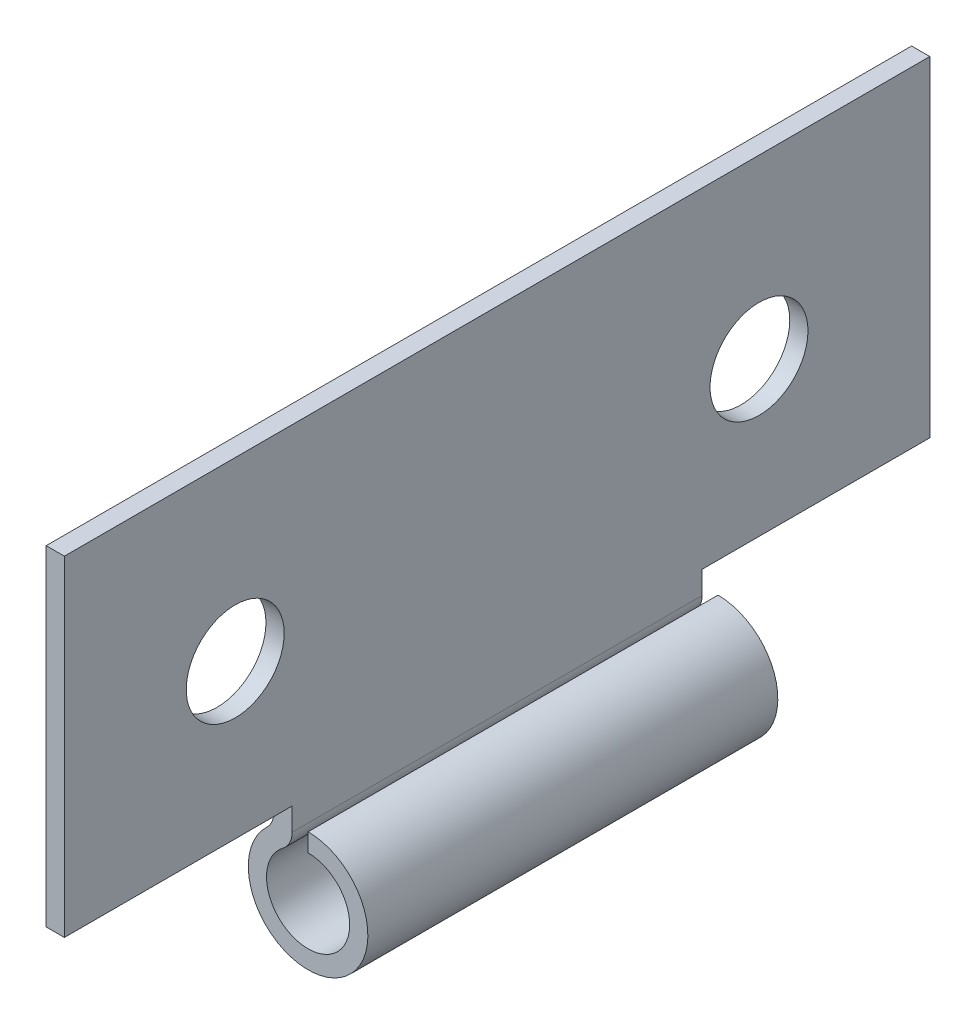
ISO-10303-21;
HEADER;
FILE_DESCRIPTION(('STEP AP214'),'2;1');
FILE_NAME('part.step','',(''),(''),'','','');
FILE_SCHEMA(('AUTOMOTIVE_DESIGN { 1 0 10303 214 1 1 1 1 }'));
ENDSEC;
DATA;
#1=APPLICATION_CONTEXT('core data for automotive mechanical design processes');
#2=APPLICATION_PROTOCOL_DEFINITION('international standard','automotive_design',2000,#1);
#3=PRODUCT_CONTEXT('',#1,'mechanical');
#4=PRODUCT('Part','Part','',(#3));
#5=PRODUCT_RELATED_PRODUCT_CATEGORY('part','',(#4));
#6=PRODUCT_DEFINITION_FORMATION('','',#4);
#7=PRODUCT_DEFINITION_CONTEXT('part definition',#1,'design');
#8=PRODUCT_DEFINITION('design','',#6,#7);
#9=PRODUCT_DEFINITION_SHAPE('','',#8);
#10=(LENGTH_UNIT() NAMED_UNIT(*) SI_UNIT(.MILLI.,.METRE.));
#11=(NAMED_UNIT(*) PLANE_ANGLE_UNIT() SI_UNIT($,.RADIAN.));
#12=(NAMED_UNIT(*) SI_UNIT($,.STERADIAN.) SOLID_ANGLE_UNIT());
#13=UNCERTAINTY_MEASURE_WITH_UNIT(LENGTH_MEASURE(1.E-05),#10,'distance_accuracy_value','');
#14=(GEOMETRIC_REPRESENTATION_CONTEXT(3) GLOBAL_UNCERTAINTY_ASSIGNED_CONTEXT((#13)) GLOBAL_UNIT_ASSIGNED_CONTEXT((#10,
#11,#12)) REPRESENTATION_CONTEXT('',''));
#15=CARTESIAN_POINT('',(0.,0.,0.));
#16=DIRECTION('',(0.,0.,1.));
#17=DIRECTION('',(1.,0.,0.));
#18=AXIS2_PLACEMENT_3D('',#15,#16,#17);
#19=CARTESIAN_POINT('',(0.,0.,38.));
#20=DIRECTION('',(1.,0.,0.));
#21=DIRECTION('',(0.,0.,-1.));
#22=AXIS2_PLACEMENT_3D('',#19,#20,#21);
#23=PLANE('',#22);
#24=CARTESIAN_POINT('',(0.,7.38124134347369,30.5));
#25=DIRECTION('',(1.,0.,0.));
#26=DIRECTION('',(0.,0.,-1.));
#27=AXIS2_PLACEMENT_3D('',#24,#25,#26);
#28=CIRCLE('',#27,2.15);
#29=CARTESIAN_POINT('',(0.,7.38124134347369,28.35));
#30=VERTEX_POINT('',#29);
#31=EDGE_CURVE('E177',#30,#30,#28,.F.);
#32=ORIENTED_EDGE('',*,*,#31,.F.);
#33=EDGE_LOOP('',(#32));
#34=FACE_BOUND('',#33,.T.);
#35=CARTESIAN_POINT('',(0.,7.38124134347369,7.5));
#36=DIRECTION('',(1.,0.,0.));
#37=DIRECTION('',(0.,0.,-1.));
#38=AXIS2_PLACEMENT_3D('',#35,#36,#37);
#39=CIRCLE('',#38,2.15);
#40=CARTESIAN_POINT('',(0.,7.38124134347369,5.35));
#41=VERTEX_POINT('',#40);
#42=EDGE_CURVE('E178',#41,#41,#39,.F.);
#43=ORIENTED_EDGE('',*,*,#42,.F.);
#44=EDGE_LOOP('',(#43));
#45=FACE_BOUND('',#44,.T.);
#46=DIRECTION('',(0.,0.,-1.));
#47=VECTOR('',#46,1.);
#48=CARTESIAN_POINT('',(0.,0.631241343473685,38.));
#49=LINE('',#48,#47);
#50=CARTESIAN_POINT('',(0.,0.631241343473685,38.));
#51=VERTEX_POINT('',#50);
#52=CARTESIAN_POINT('',(0.,0.631241343473685,28.));
#53=VERTEX_POINT('',#52);
#54=EDGE_CURVE('E145',#51,#53,#49,.T.);
#55=ORIENTED_EDGE('',*,*,#54,.F.);
#56=DIRECTION('',(0.,-1.,0.));
#57=VECTOR('',#56,1.);
#58=CARTESIAN_POINT('',(0.,0.,38.));
#59=LINE('',#58,#57);
#60=CARTESIAN_POINT('',(0.,15.1312413434737,38.));
#61=VERTEX_POINT('',#60);
#62=EDGE_CURVE('E189',#61,#51,#59,.T.);
#63=ORIENTED_EDGE('',*,*,#62,.F.);
#64=DIRECTION('',(0.,0.,-1.));
#65=VECTOR('',#64,1.);
#66=CARTESIAN_POINT('',(0.,15.1312413434737,38.));
#67=LINE('',#66,#65);
#68=CARTESIAN_POINT('',(0.,15.1312413434737,0.));
#69=VERTEX_POINT('',#68);
#70=EDGE_CURVE('E219',#61,#69,#67,.T.);
#71=ORIENTED_EDGE('',*,*,#70,.T.);
#72=DIRECTION('',(0.,-1.,0.));
#73=VECTOR('',#72,1.);
#74=CARTESIAN_POINT('',(0.,0.,0.));
#75=LINE('',#74,#73);
#76=CARTESIAN_POINT('',(0.,0.631241343473684,0.));
#77=VERTEX_POINT('',#76);
#78=EDGE_CURVE('E143',#69,#77,#75,.T.);
#79=ORIENTED_EDGE('',*,*,#78,.T.);
#80=DIRECTION('',(0.,0.,-1.));
#81=VECTOR('',#80,1.);
#82=CARTESIAN_POINT('',(0.,0.631241343473685,38.));
#83=LINE('',#82,#81);
#84=CARTESIAN_POINT('',(0.,0.631241343473685,10.));
#85=VERTEX_POINT('',#84);
#86=EDGE_CURVE('E57',#85,#77,#83,.T.);
#87=ORIENTED_EDGE('',*,*,#86,.F.);
#88=DIRECTION('',(0.,-1.,0.));
#89=VECTOR('',#88,1.);
#90=CARTESIAN_POINT('',(0.,0.,9.99999999999999));
#91=LINE('',#90,#89);
#92=CARTESIAN_POINT('',(0.,0.,9.99999999999999));
#93=VERTEX_POINT('',#92);
#94=EDGE_CURVE('E124',#85,#93,#91,.T.);
#95=ORIENTED_EDGE('',*,*,#94,.T.);
#96=DIRECTION('',(0.,0.,-1.));
#97=VECTOR('',#96,1.);
#98=CARTESIAN_POINT('',(0.,0.,38.));
#99=LINE('',#98,#97);
#100=CARTESIAN_POINT('',(0.,0.,28.));
#101=VERTEX_POINT('',#100);
#102=EDGE_CURVE('E217',#101,#93,#99,.T.);
#103=ORIENTED_EDGE('',*,*,#102,.F.);
#104=DIRECTION('',(0.,-1.,0.));
#105=VECTOR('',#104,1.);
#106=CARTESIAN_POINT('',(0.,0.,28.));
#107=LINE('',#106,#105);
#108=EDGE_CURVE('E171',#53,#101,#107,.T.);
#109=ORIENTED_EDGE('',*,*,#108,.F.);
#110=EDGE_LOOP('',(#55,#63,#71,#79,#87,#95,#103,#109));
#111=FACE_BOUND('',#110,.T.);
#112=ADVANCED_FACE('F34',(#34,#45,#111),#23,.F.);
#113=CARTESIAN_POINT('',(-1.,0.,38.));
#114=DIRECTION('',(0.,0.,-1.));
#115=DIRECTION('',(-1.,0.,0.));
#116=AXIS2_PLACEMENT_3D('',#113,#114,#115);
#117=CYLINDRICAL_SURFACE('',#116,1.);
#118=CARTESIAN_POINT('',(-1.,0.,28.));
#119=DIRECTION('',(0.,0.,1.));
#120=DIRECTION('',(1.,0.,0.));
#121=AXIS2_PLACEMENT_3D('',#118,#119,#120);
#122=CIRCLE('',#121,1.);
#123=CARTESIAN_POINT('',(-0.310344827586207,-0.724137931034484,28.));
#124=VERTEX_POINT('',#123);
#125=EDGE_CURVE('E169',#101,#124,#122,.F.);
#126=ORIENTED_EDGE('',*,*,#125,.F.);
#127=ORIENTED_EDGE('',*,*,#102,.T.);
#128=CARTESIAN_POINT('',(-1.,0.,9.99999999999999));
#129=DIRECTION('',(0.,0.,1.));
#130=DIRECTION('',(1.,0.,0.));
#131=AXIS2_PLACEMENT_3D('',#128,#129,#130);
#132=CIRCLE('',#131,1.);
#133=CARTESIAN_POINT('',(-0.310344827586207,-0.724137931034484,9.99999999999999));
#134=VERTEX_POINT('',#133);
#135=EDGE_CURVE('E129',#93,#134,#132,.F.);
#136=ORIENTED_EDGE('',*,*,#135,.T.);
#137=DIRECTION('',(0.,0.,-1.));
#138=VECTOR('',#137,1.);
#139=CARTESIAN_POINT('',(-0.310344827586207,-0.724137931034484,38.));
#140=LINE('',#139,#138);
#141=EDGE_CURVE('E214',#124,#134,#140,.T.);
#142=ORIENTED_EDGE('',*,*,#141,.F.);
#143=EDGE_LOOP('',(#126,#127,#136,#142));
#144=FACE_BOUND('',#143,.T.);
#145=ADVANCED_FACE('F248',(#144),#117,.F.);
#146=CARTESIAN_POINT('',(1.5,-2.625,38.));
#147=DIRECTION('',(0.,0.,-1.));
#148=DIRECTION('',(-1.,0.,0.));
#149=AXIS2_PLACEMENT_3D('',#146,#147,#148);
#150=CYLINDRICAL_SURFACE('',#149,2.625);
#151=DIRECTION('',(0.,0.,-1.));
#152=VECTOR('',#151,1.);
#153=CARTESIAN_POINT('',(1.5,0.,38.));
#154=LINE('',#153,#152);
#155=CARTESIAN_POINT('',(1.5,0.,28.));
#156=VERTEX_POINT('',#155);
#157=CARTESIAN_POINT('',(1.5,0.,9.99999999999999));
#158=VERTEX_POINT('',#157);
#159=EDGE_CURVE('E211',#156,#158,#154,.T.);
#160=ORIENTED_EDGE('',*,*,#159,.F.);
#161=CARTESIAN_POINT('',(1.5,-2.625,28.));
#162=DIRECTION('',(0.,0.,1.));
#163=DIRECTION('',(1.,0.,0.));
#164=AXIS2_PLACEMENT_3D('',#161,#162,#163);
#165=CIRCLE('',#164,2.625);
#166=EDGE_CURVE('E167',#124,#156,#165,.T.);
#167=ORIENTED_EDGE('',*,*,#166,.F.);
#168=ORIENTED_EDGE('',*,*,#141,.T.);
#169=CARTESIAN_POINT('',(1.5,-2.625,9.99999999999999));
#170=DIRECTION('',(0.,0.,1.));
#171=DIRECTION('',(1.,0.,0.));
#172=AXIS2_PLACEMENT_3D('',#169,#170,#171);
#173=CIRCLE('',#172,2.625);
#174=EDGE_CURVE('E159',#134,#158,#173,.T.);
#175=ORIENTED_EDGE('',*,*,#174,.T.);
#176=EDGE_LOOP('',(#160,#167,#168,#175));
#177=FACE_BOUND('',#176,.T.);
#178=ADVANCED_FACE('F244',(#177),#150,.T.);
#179=CARTESIAN_POINT('',(1.5,0.,38.));
#180=DIRECTION('',(1.,0.,0.));
#181=DIRECTION('',(0.,0.,-1.));
#182=AXIS2_PLACEMENT_3D('',#179,#180,#181);
#183=PLANE('',#182);
#184=DIRECTION('',(0.,-1.,0.));
#185=VECTOR('',#184,1.);
#186=CARTESIAN_POINT('',(1.5,0.,28.));
#187=LINE('',#186,#185);
#188=CARTESIAN_POINT('',(1.5,-0.8,28.));
#189=VERTEX_POINT('',#188);
#190=EDGE_CURVE('E165',#156,#189,#187,.T.);
#191=ORIENTED_EDGE('',*,*,#190,.F.);
#192=ORIENTED_EDGE('',*,*,#159,.T.);
#193=DIRECTION('',(0.,-1.,0.));
#194=VECTOR('',#193,1.);
#195=CARTESIAN_POINT('',(1.5,0.,9.99999999999999));
#196=LINE('',#195,#194);
#197=CARTESIAN_POINT('',(1.5,-0.8,9.99999999999999));
#198=VERTEX_POINT('',#197);
#199=EDGE_CURVE('E156',#158,#198,#196,.T.);
#200=ORIENTED_EDGE('',*,*,#199,.T.);
#201=DIRECTION('',(0.,0.,-1.));
#202=VECTOR('',#201,1.);
#203=CARTESIAN_POINT('',(1.5,-0.8,38.));
#204=LINE('',#203,#202);
#205=EDGE_CURVE('E208',#189,#198,#204,.T.);
#206=ORIENTED_EDGE('',*,*,#205,.F.);
#207=EDGE_LOOP('',(#191,#192,#200,#206));
#208=FACE_BOUND('',#207,.T.);
#209=ADVANCED_FACE('F240',(#208),#183,.F.);
#210=CARTESIAN_POINT('',(1.5,-2.625,38.));
#211=DIRECTION('',(0.,0.,-1.));
#212=DIRECTION('',(-1.,0.,0.));
#213=AXIS2_PLACEMENT_3D('',#210,#211,#212);
#214=CYLINDRICAL_SURFACE('',#213,1.825);
#215=CARTESIAN_POINT('',(1.5,-2.625,28.));
#216=DIRECTION('',(0.,0.,1.));
#217=DIRECTION('',(1.,0.,0.));
#218=AXIS2_PLACEMENT_3D('',#215,#216,#217);
#219=CIRCLE('',#218,1.825);
#220=CARTESIAN_POINT('',(0.401769911504423,-1.16742815864089,28.));
#221=VERTEX_POINT('',#220);
#222=EDGE_CURVE('E163',#189,#221,#219,.F.);
#223=ORIENTED_EDGE('',*,*,#222,.F.);
#224=ORIENTED_EDGE('',*,*,#205,.T.);
#225=CARTESIAN_POINT('',(1.5,-2.625,9.99999999999999));
#226=DIRECTION('',(0.,0.,1.));
#227=DIRECTION('',(1.,0.,0.));
#228=AXIS2_PLACEMENT_3D('',#225,#226,#227);
#229=CIRCLE('',#228,1.825);
#230=CARTESIAN_POINT('',(0.401769911504423,-1.16742815864089,9.99999999999999));
#231=VERTEX_POINT('',#230);
#232=EDGE_CURVE('E153',#198,#231,#229,.F.);
#233=ORIENTED_EDGE('',*,*,#232,.T.);
#234=DIRECTION('',(0.,0.,-1.));
#235=VECTOR('',#234,1.);
#236=CARTESIAN_POINT('',(0.401769911504423,-1.16742815864089,38.));
#237=LINE('',#236,#235);
#238=EDGE_CURVE('E205',#221,#231,#237,.T.);
#239=ORIENTED_EDGE('',*,*,#238,.F.);
#240=EDGE_LOOP('',(#223,#224,#233,#239));
#241=FACE_BOUND('',#240,.T.);
#242=ADVANCED_FACE('F235',(#241),#214,.F.);
#243=CARTESIAN_POINT('',(-0.200000000000001,-0.368758656526303,38.));
#244=DIRECTION('',(0.,0.,-1.));
#245=DIRECTION('',(-1.,0.,0.));
#246=AXIS2_PLACEMENT_3D('',#243,#244,#245);
#247=CYLINDRICAL_SURFACE('',#246,1.);
#248=CARTESIAN_POINT('',(-0.200000000000001,-0.368758656526303,28.));
#249=DIRECTION('',(0.,0.,1.));
#250=DIRECTION('',(1.,0.,0.));
#251=AXIS2_PLACEMENT_3D('',#248,#249,#250);
#252=CIRCLE('',#251,1.);
#253=CARTESIAN_POINT('',(0.799999999999999,-0.368758656526303,28.));
#254=VERTEX_POINT('',#253);
#255=EDGE_CURVE('E133',#221,#254,#252,.T.);
#256=ORIENTED_EDGE('',*,*,#255,.F.);
#257=ORIENTED_EDGE('',*,*,#238,.T.);
#258=CARTESIAN_POINT('',(-0.200000000000001,-0.368758656526303,9.99999999999999));
#259=DIRECTION('',(0.,0.,1.));
#260=DIRECTION('',(1.,0.,0.));
#261=AXIS2_PLACEMENT_3D('',#258,#259,#260);
#262=CIRCLE('',#261,1.);
#263=CARTESIAN_POINT('',(0.799999999999999,-0.368758656526303,9.99999999999999));
#264=VERTEX_POINT('',#263);
#265=EDGE_CURVE('E150',#231,#264,#262,.T.);
#266=ORIENTED_EDGE('',*,*,#265,.T.);
#267=DIRECTION('',(0.,0.,-1.));
#268=VECTOR('',#267,1.);
#269=CARTESIAN_POINT('',(0.799999999999999,-0.368758656526303,38.));
#270=LINE('',#269,#268);
#271=EDGE_CURVE('E202',#254,#264,#270,.T.);
#272=ORIENTED_EDGE('',*,*,#271,.F.);
#273=EDGE_LOOP('',(#256,#257,#266,#272));
#274=FACE_BOUND('',#273,.T.);
#275=ADVANCED_FACE('F231',(#274),#247,.T.);
#276=CARTESIAN_POINT('',(0.799999999999999,-0.368758656526303,38.));
#277=DIRECTION('',(-1.,0.,0.));
#278=DIRECTION('',(0.,0.,1.));
#279=AXIS2_PLACEMENT_3D('',#276,#277,#278);
#280=PLANE('',#279);
#281=CARTESIAN_POINT('',(0.799999999999999,7.38124134347369,30.5));
#282=DIRECTION('',(1.,0.,0.));
#283=DIRECTION('',(0.,0.,-1.));
#284=AXIS2_PLACEMENT_3D('',#281,#282,#283);
#285=CIRCLE('',#284,2.15);
#286=CARTESIAN_POINT('',(0.799999999999999,7.38124134347369,28.35));
#287=VERTEX_POINT('',#286);
#288=EDGE_CURVE('E174',#287,#287,#285,.T.);
#289=ORIENTED_EDGE('',*,*,#288,.F.);
#290=EDGE_LOOP('',(#289));
#291=FACE_BOUND('',#290,.T.);
#292=CARTESIAN_POINT('',(0.799999999999999,7.38124134347369,7.5));
#293=DIRECTION('',(1.,0.,0.));
#294=DIRECTION('',(0.,0.,-1.));
#295=AXIS2_PLACEMENT_3D('',#292,#293,#294);
#296=CIRCLE('',#295,2.15);
#297=CARTESIAN_POINT('',(0.799999999999999,7.38124134347369,5.35));
#298=VERTEX_POINT('',#297);
#299=EDGE_CURVE('E173',#298,#298,#296,.T.);
#300=ORIENTED_EDGE('',*,*,#299,.F.);
#301=EDGE_LOOP('',(#300));
#302=FACE_BOUND('',#301,.T.);
#303=DIRECTION('',(0.,0.,1.));
#304=VECTOR('',#303,1.);
#305=CARTESIAN_POINT('',(0.799999999999999,0.631241343473685,38.));
#306=LINE('',#305,#304);
#307=CARTESIAN_POINT('',(0.799999999999999,0.631241343473685,28.));
#308=VERTEX_POINT('',#307);
#309=CARTESIAN_POINT('',(0.799999999999999,0.631241343473685,38.));
#310=VERTEX_POINT('',#309);
#311=EDGE_CURVE('E49',#308,#310,#306,.T.);
#312=ORIENTED_EDGE('',*,*,#311,.F.);
#313=DIRECTION('',(0.,1.,0.));
#314=VECTOR('',#313,1.);
#315=CARTESIAN_POINT('',(0.799999999999999,-0.368758656526303,28.));
#316=LINE('',#315,#314);
#317=EDGE_CURVE('E11',#254,#308,#316,.T.);
#318=ORIENTED_EDGE('',*,*,#317,.F.);
#319=ORIENTED_EDGE('',*,*,#271,.T.);
#320=DIRECTION('',(0.,1.,0.));
#321=VECTOR('',#320,1.);
#322=CARTESIAN_POINT('',(0.799999999999999,-0.368758656526303,9.99999999999999));
#323=LINE('',#322,#321);
#324=CARTESIAN_POINT('',(0.799999999999999,0.631241343473685,10.));
#325=VERTEX_POINT('',#324);
#326=EDGE_CURVE('E42',#264,#325,#323,.T.);
#327=ORIENTED_EDGE('',*,*,#326,.T.);
#328=DIRECTION('',(0.,0.,1.));
#329=VECTOR('',#328,1.);
#330=CARTESIAN_POINT('',(0.799999999999999,0.631241343473685,38.));
#331=LINE('',#330,#329);
#332=CARTESIAN_POINT('',(0.799999999999999,0.631241343473685,0.));
#333=VERTEX_POINT('',#332);
#334=EDGE_CURVE('E137',#333,#325,#331,.T.);
#335=ORIENTED_EDGE('',*,*,#334,.F.);
#336=DIRECTION('',(0.,1.,0.));
#337=VECTOR('',#336,1.);
#338=CARTESIAN_POINT('',(0.799999999999999,-0.368758656526303,0.));
#339=LINE('',#338,#337);
#340=CARTESIAN_POINT('',(0.799999999999999,15.1312413434737,0.));
#341=VERTEX_POINT('',#340);
#342=EDGE_CURVE('E190',#333,#341,#339,.T.);
#343=ORIENTED_EDGE('',*,*,#342,.T.);
#344=DIRECTION('',(0.,0.,-1.));
#345=VECTOR('',#344,1.);
#346=CARTESIAN_POINT('',(0.799999999999999,15.1312413434737,38.));
#347=LINE('',#346,#345);
#348=CARTESIAN_POINT('',(0.799999999999999,15.1312413434737,38.));
#349=VERTEX_POINT('',#348);
#350=EDGE_CURVE('E195',#349,#341,#347,.T.);
#351=ORIENTED_EDGE('',*,*,#350,.F.);
#352=DIRECTION('',(0.,1.,0.));
#353=VECTOR('',#352,1.);
#354=CARTESIAN_POINT('',(0.799999999999999,-0.368758656526303,38.));
#355=LINE('',#354,#353);
#356=EDGE_CURVE('E193',#310,#349,#355,.T.);
#357=ORIENTED_EDGE('',*,*,#356,.F.);
#358=EDGE_LOOP('',(#312,#318,#319,#327,#335,#343,#351,#357));
#359=FACE_BOUND('',#358,.T.);
#360=ADVANCED_FACE('F225',(#291,#302,#359),#280,.F.);
#361=CARTESIAN_POINT('',(-0.200000000000001,-0.368758656526303,38.));
#362=DIRECTION('',(0.,0.,1.));
#363=DIRECTION('',(1.,0.,0.));
#364=AXIS2_PLACEMENT_3D('',#361,#362,#363);
#365=PLANE('',#364);
#366=ORIENTED_EDGE('',*,*,#62,.T.);
#367=DIRECTION('',(1.,0.,0.));
#368=VECTOR('',#367,1.);
#369=CARTESIAN_POINT('',(-0.200000000000001,0.631241343473685,38.));
#370=LINE('',#369,#368);
#371=EDGE_CURVE('E223',#51,#310,#370,.T.);
#372=ORIENTED_EDGE('',*,*,#371,.T.);
#373=ORIENTED_EDGE('',*,*,#356,.T.);
#374=DIRECTION('',(-1.,0.,0.));
#375=VECTOR('',#374,1.);
#376=CARTESIAN_POINT('',(0.,15.1312413434737,38.));
#377=LINE('',#376,#375);
#378=EDGE_CURVE('E186',#349,#61,#377,.T.);
#379=ORIENTED_EDGE('',*,*,#378,.T.);
#380=EDGE_LOOP('',(#366,#372,#373,#379));
#381=FACE_BOUND('',#380,.T.);
#382=ADVANCED_FACE('F259',(#381),#365,.T.);
#383=CARTESIAN_POINT('',(-0.200000000000001,-0.368758656526303,0.));
#384=DIRECTION('',(0.,0.,1.));
#385=DIRECTION('',(1.,0.,0.));
#386=AXIS2_PLACEMENT_3D('',#383,#384,#385);
#387=PLANE('',#386);
#388=DIRECTION('',(1.,0.,0.));
#389=VECTOR('',#388,1.);
#390=CARTESIAN_POINT('',(-0.200000000000001,0.631241343473685,0.));
#391=LINE('',#390,#389);
#392=EDGE_CURVE('E221',#77,#333,#391,.T.);
#393=ORIENTED_EDGE('',*,*,#392,.F.);
#394=ORIENTED_EDGE('',*,*,#78,.F.);
#395=DIRECTION('',(-1.,0.,0.));
#396=VECTOR('',#395,1.);
#397=CARTESIAN_POINT('',(0.,15.1312413434737,0.));
#398=LINE('',#397,#396);
#399=EDGE_CURVE('E181',#341,#69,#398,.T.);
#400=ORIENTED_EDGE('',*,*,#399,.F.);
#401=ORIENTED_EDGE('',*,*,#342,.F.);
#402=EDGE_LOOP('',(#393,#394,#400,#401));
#403=FACE_BOUND('',#402,.T.);
#404=ADVANCED_FACE('F264',(#403),#387,.F.);
#405=CARTESIAN_POINT('',(0.,15.1312413434737,38.));
#406=DIRECTION('',(0.,-1.,0.));
#407=DIRECTION('',(0.,0.,-1.));
#408=AXIS2_PLACEMENT_3D('',#405,#406,#407);
#409=PLANE('',#408);
#410=ORIENTED_EDGE('',*,*,#399,.T.);
#411=ORIENTED_EDGE('',*,*,#70,.F.);
#412=ORIENTED_EDGE('',*,*,#378,.F.);
#413=ORIENTED_EDGE('',*,*,#350,.T.);
#414=EDGE_LOOP('',(#410,#411,#412,#413));
#415=FACE_BOUND('',#414,.T.);
#416=ADVANCED_FACE('F36',(#415),#409,.F.);
#417=CARTESIAN_POINT('',(-1.126,7.38124134347369,7.5));
#418=DIRECTION('',(1.,0.,0.));
#419=DIRECTION('',(0.,0.,-1.));
#420=AXIS2_PLACEMENT_3D('',#417,#418,#419);
#421=CYLINDRICAL_SURFACE('',#420,2.15);
#422=ORIENTED_EDGE('',*,*,#299,.T.);
#423=EDGE_LOOP('',(#422));
#424=FACE_BOUND('',#423,.T.);
#425=ORIENTED_EDGE('',*,*,#42,.T.);
#426=EDGE_LOOP('',(#425));
#427=FACE_BOUND('',#426,.T.);
#428=ADVANCED_FACE('F271',(#424,#427),#421,.F.);
#429=CARTESIAN_POINT('',(-1.126,7.38124134347369,30.5));
#430=DIRECTION('',(1.,0.,0.));
#431=DIRECTION('',(0.,0.,-1.));
#432=AXIS2_PLACEMENT_3D('',#429,#430,#431);
#433=CYLINDRICAL_SURFACE('',#432,2.15);
#434=ORIENTED_EDGE('',*,*,#288,.T.);
#435=EDGE_LOOP('',(#434));
#436=FACE_BOUND('',#435,.T.);
#437=ORIENTED_EDGE('',*,*,#31,.T.);
#438=EDGE_LOOP('',(#437));
#439=FACE_BOUND('',#438,.T.);
#440=ADVANCED_FACE('F300',(#436,#439),#433,.F.);
#441=CARTESIAN_POINT('',(-1.125,0.,10.));
#442=DIRECTION('',(0.,0.,1.));
#443=DIRECTION('',(1.,0.,0.));
#444=AXIS2_PLACEMENT_3D('',#441,#442,#443);
#445=PLANE('',#444);
#446=DIRECTION('',(1.,0.,0.));
#447=VECTOR('',#446,1.);
#448=CARTESIAN_POINT('',(-1.125,0.631241343473685,10.));
#449=LINE('',#448,#447);
#450=EDGE_CURVE('E126',#85,#325,#449,.T.);
#451=ORIENTED_EDGE('',*,*,#450,.T.);
#452=ORIENTED_EDGE('',*,*,#326,.F.);
#453=ORIENTED_EDGE('',*,*,#265,.F.);
#454=ORIENTED_EDGE('',*,*,#232,.F.);
#455=ORIENTED_EDGE('',*,*,#199,.F.);
#456=ORIENTED_EDGE('',*,*,#174,.F.);
#457=ORIENTED_EDGE('',*,*,#135,.F.);
#458=ORIENTED_EDGE('',*,*,#94,.F.);
#459=EDGE_LOOP('',(#451,#452,#453,#454,#455,#456,#457,#458));
#460=FACE_BOUND('',#459,.T.);
#461=ADVANCED_FACE('F125',(#460),#445,.F.);
#462=CARTESIAN_POINT('',(-1.125,0.631241343473685,0.));
#463=DIRECTION('',(0.,-1.,0.));
#464=DIRECTION('',(0.,0.,-1.));
#465=AXIS2_PLACEMENT_3D('',#462,#463,#464);
#466=PLANE('',#465);
#467=ORIENTED_EDGE('',*,*,#86,.T.);
#468=ORIENTED_EDGE('',*,*,#392,.T.);
#469=ORIENTED_EDGE('',*,*,#334,.T.);
#470=ORIENTED_EDGE('',*,*,#450,.F.);
#471=EDGE_LOOP('',(#467,#468,#469,#470));
#472=FACE_BOUND('',#471,.T.);
#473=ADVANCED_FACE('F135',(#472),#466,.T.);
#474=CARTESIAN_POINT('',(-1.125,0.,28.));
#475=DIRECTION('',(0.,0.,1.));
#476=DIRECTION('',(1.,0.,0.));
#477=AXIS2_PLACEMENT_3D('',#474,#475,#476);
#478=PLANE('',#477);
#479=ORIENTED_EDGE('',*,*,#108,.T.);
#480=ORIENTED_EDGE('',*,*,#125,.T.);
#481=ORIENTED_EDGE('',*,*,#166,.T.);
#482=ORIENTED_EDGE('',*,*,#190,.T.);
#483=ORIENTED_EDGE('',*,*,#222,.T.);
#484=ORIENTED_EDGE('',*,*,#255,.T.);
#485=ORIENTED_EDGE('',*,*,#317,.T.);
#486=DIRECTION('',(1.,0.,0.));
#487=VECTOR('',#486,1.);
#488=CARTESIAN_POINT('',(-1.125,0.631241343473685,28.));
#489=LINE('',#488,#487);
#490=EDGE_CURVE('E138',#53,#308,#489,.T.);
#491=ORIENTED_EDGE('',*,*,#490,.F.);
#492=EDGE_LOOP('',(#479,#480,#481,#482,#483,#484,#485,#491));
#493=FACE_BOUND('',#492,.T.);
#494=ADVANCED_FACE('F252',(#493),#478,.T.);
#495=CARTESIAN_POINT('',(-1.125,0.631241343473685,0.));
#496=DIRECTION('',(0.,-1.,0.));
#497=DIRECTION('',(0.,0.,-1.));
#498=AXIS2_PLACEMENT_3D('',#495,#496,#497);
#499=PLANE('',#498);
#500=ORIENTED_EDGE('',*,*,#54,.T.);
#501=ORIENTED_EDGE('',*,*,#490,.T.);
#502=ORIENTED_EDGE('',*,*,#311,.T.);
#503=ORIENTED_EDGE('',*,*,#371,.F.);
#504=EDGE_LOOP('',(#500,#501,#502,#503));
#505=FACE_BOUND('',#504,.T.);
#506=ADVANCED_FACE('F254',(#505),#499,.T.);
#507=CLOSED_SHELL('',(#112,#145,#178,#209,#242,#275,#360,#382,#404,#416,#428,#440,#461,#473,
#494,#506));
#508=MANIFOLD_SOLID_BREP('B2',#507);
#509=ADVANCED_BREP_SHAPE_REPRESENTATION('',(#18,#508),#14);
#510=SHAPE_DEFINITION_REPRESENTATION(#9,#509);
ENDSEC;
END-ISO-10303-21;
